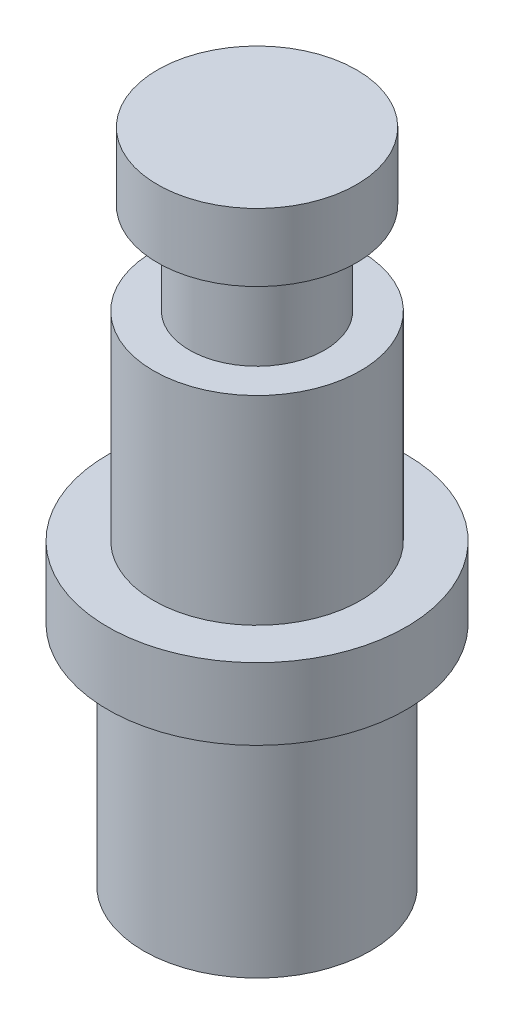
ISO-10303-21;
HEADER;
FILE_DESCRIPTION(('STEP AP214'),'2;1');
FILE_NAME('part.step','',(''),(''),'','','');
FILE_SCHEMA(('AUTOMOTIVE_DESIGN { 1 0 10303 214 1 1 1 1 }'));
ENDSEC;
DATA;
#1=APPLICATION_CONTEXT('core data for automotive mechanical design processes');
#2=APPLICATION_PROTOCOL_DEFINITION('international standard','automotive_design',2000,#1);
#3=PRODUCT_CONTEXT('',#1,'mechanical');
#4=PRODUCT('Part','Part','',(#3));
#5=PRODUCT_RELATED_PRODUCT_CATEGORY('part','',(#4));
#6=PRODUCT_DEFINITION_FORMATION('','',#4);
#7=PRODUCT_DEFINITION_CONTEXT('part definition',#1,'design');
#8=PRODUCT_DEFINITION('design','',#6,#7);
#9=PRODUCT_DEFINITION_SHAPE('','',#8);
#10=(LENGTH_UNIT() NAMED_UNIT(*) SI_UNIT(.MILLI.,.METRE.));
#11=(NAMED_UNIT(*) PLANE_ANGLE_UNIT() SI_UNIT($,.RADIAN.));
#12=(NAMED_UNIT(*) SI_UNIT($,.STERADIAN.) SOLID_ANGLE_UNIT());
#13=UNCERTAINTY_MEASURE_WITH_UNIT(LENGTH_MEASURE(1.E-05),#10,'distance_accuracy_value','');
#14=(GEOMETRIC_REPRESENTATION_CONTEXT(3) GLOBAL_UNCERTAINTY_ASSIGNED_CONTEXT((#13)) GLOBAL_UNIT_ASSIGNED_CONTEXT((#10,
#11,#12)) REPRESENTATION_CONTEXT('',''));
#15=CARTESIAN_POINT('',(0.,0.,0.));
#16=DIRECTION('',(0.,0.,1.));
#17=DIRECTION('',(1.,0.,0.));
#18=AXIS2_PLACEMENT_3D('',#15,#16,#17);
#19=CARTESIAN_POINT('',(0.,0.,0.));
#20=DIRECTION('',(0.,-1.,0.));
#21=DIRECTION('',(0.,0.,-1.));
#22=AXIS2_PLACEMENT_3D('',#19,#20,#21);
#23=PLANE('',#22);
#24=CARTESIAN_POINT('',(0.,0.,0.));
#25=DIRECTION('',(0.,-1.,0.));
#26=DIRECTION('',(0.,0.,-1.));
#27=AXIS2_PLACEMENT_3D('',#24,#25,#26);
#28=CIRCLE('',#27,3.6195);
#29=CARTESIAN_POINT('',(0.,0.,-3.6195));
#30=VERTEX_POINT('',#29);
#31=EDGE_CURVE('E12',#30,#30,#28,.T.);
#32=ORIENTED_EDGE('',*,*,#31,.T.);
#33=EDGE_LOOP('',(#32));
#34=FACE_BOUND('',#33,.T.);
#35=ADVANCED_FACE('F50',(#34),#23,.T.);
#36=CARTESIAN_POINT('',(0.,0.,0.));
#37=DIRECTION('',(0.,-1.,0.));
#38=DIRECTION('',(0.,0.,-1.));
#39=AXIS2_PLACEMENT_3D('',#36,#37,#38);
#40=CYLINDRICAL_SURFACE('',#39,3.6195);
#41=CARTESIAN_POINT('',(0.,7.239,0.));
#42=DIRECTION('',(0.,-1.,0.));
#43=DIRECTION('',(0.,0.,-1.));
#44=AXIS2_PLACEMENT_3D('',#41,#42,#43);
#45=CIRCLE('',#44,3.6195);
#46=CARTESIAN_POINT('',(0.,7.239,-3.6195));
#47=VERTEX_POINT('',#46);
#48=EDGE_CURVE('E57',#47,#47,#45,.T.);
#49=ORIENTED_EDGE('',*,*,#48,.T.);
#50=EDGE_LOOP('',(#49));
#51=FACE_BOUND('',#50,.T.);
#52=ORIENTED_EDGE('',*,*,#31,.F.);
#53=EDGE_LOOP('',(#52));
#54=FACE_BOUND('',#53,.T.);
#55=ADVANCED_FACE('F110',(#51,#54),#40,.T.);
#56=CARTESIAN_POINT('',(3.6195,7.239,0.));
#57=DIRECTION('',(0.,-1.,0.));
#58=DIRECTION('',(0.,0.,-1.));
#59=AXIS2_PLACEMENT_3D('',#56,#57,#58);
#60=PLANE('',#59);
#61=CARTESIAN_POINT('',(0.,7.239,0.));
#62=DIRECTION('',(0.,-1.,0.));
#63=DIRECTION('',(0.,0.,-1.));
#64=AXIS2_PLACEMENT_3D('',#61,#62,#63);
#65=CIRCLE('',#64,4.7625);
#66=CARTESIAN_POINT('',(0.,7.239,-4.7625));
#67=VERTEX_POINT('',#66);
#68=EDGE_CURVE('E63',#67,#67,#65,.T.);
#69=ORIENTED_EDGE('',*,*,#68,.T.);
#70=EDGE_LOOP('',(#69));
#71=FACE_BOUND('',#70,.T.);
#72=ORIENTED_EDGE('',*,*,#48,.F.);
#73=EDGE_LOOP('',(#72));
#74=FACE_BOUND('',#73,.T.);
#75=ADVANCED_FACE('F114',(#71,#74),#60,.T.);
#76=CARTESIAN_POINT('',(0.,0.,0.));
#77=DIRECTION('',(0.,-1.,0.));
#78=DIRECTION('',(0.,0.,-1.));
#79=AXIS2_PLACEMENT_3D('',#76,#77,#78);
#80=CYLINDRICAL_SURFACE('',#79,4.7625);
#81=CARTESIAN_POINT('',(0.,9.525,0.));
#82=DIRECTION('',(0.,-1.,0.));
#83=DIRECTION('',(0.,0.,-1.));
#84=AXIS2_PLACEMENT_3D('',#81,#82,#83);
#85=CIRCLE('',#84,4.7625);
#86=CARTESIAN_POINT('',(0.,9.525,-4.7625));
#87=VERTEX_POINT('',#86);
#88=EDGE_CURVE('E68',#87,#87,#85,.T.);
#89=ORIENTED_EDGE('',*,*,#88,.T.);
#90=EDGE_LOOP('',(#89));
#91=FACE_BOUND('',#90,.T.);
#92=ORIENTED_EDGE('',*,*,#68,.F.);
#93=EDGE_LOOP('',(#92));
#94=FACE_BOUND('',#93,.T.);
#95=ADVANCED_FACE('F118',(#91,#94),#80,.T.);
#96=CARTESIAN_POINT('',(4.7625,9.525,0.));
#97=DIRECTION('',(0.,1.,0.));
#98=DIRECTION('',(0.,0.,1.));
#99=AXIS2_PLACEMENT_3D('',#96,#97,#98);
#100=PLANE('',#99);
#101=CARTESIAN_POINT('',(0.,9.525,0.));
#102=DIRECTION('',(0.,-1.,0.));
#103=DIRECTION('',(0.,0.,-1.));
#104=AXIS2_PLACEMENT_3D('',#101,#102,#103);
#105=CIRCLE('',#104,3.302);
#106=CARTESIAN_POINT('',(0.,9.525,-3.302));
#107=VERTEX_POINT('',#106);
#108=EDGE_CURVE('E73',#107,#107,#105,.T.);
#109=ORIENTED_EDGE('',*,*,#108,.T.);
#110=EDGE_LOOP('',(#109));
#111=FACE_BOUND('',#110,.T.);
#112=ORIENTED_EDGE('',*,*,#88,.F.);
#113=EDGE_LOOP('',(#112));
#114=FACE_BOUND('',#113,.T.);
#115=ADVANCED_FACE('F125',(#111,#114),#100,.T.);
#116=CARTESIAN_POINT('',(0.,0.,0.));
#117=DIRECTION('',(0.,-1.,0.));
#118=DIRECTION('',(0.,0.,-1.));
#119=AXIS2_PLACEMENT_3D('',#116,#117,#118);
#120=CYLINDRICAL_SURFACE('',#119,3.302);
#121=CARTESIAN_POINT('',(0.,15.875,0.));
#122=DIRECTION('',(0.,-1.,0.));
#123=DIRECTION('',(0.,0.,-1.));
#124=AXIS2_PLACEMENT_3D('',#121,#122,#123);
#125=CIRCLE('',#124,3.302);
#126=CARTESIAN_POINT('',(0.,15.875,-3.302));
#127=VERTEX_POINT('',#126);
#128=EDGE_CURVE('E77',#127,#127,#125,.T.);
#129=ORIENTED_EDGE('',*,*,#128,.T.);
#130=EDGE_LOOP('',(#129));
#131=FACE_BOUND('',#130,.T.);
#132=ORIENTED_EDGE('',*,*,#108,.F.);
#133=EDGE_LOOP('',(#132));
#134=FACE_BOUND('',#133,.T.);
#135=ADVANCED_FACE('F129',(#131,#134),#120,.T.);
#136=CARTESIAN_POINT('',(3.302,15.875,0.));
#137=DIRECTION('',(0.,1.,0.));
#138=DIRECTION('',(0.,0.,1.));
#139=AXIS2_PLACEMENT_3D('',#136,#137,#138);
#140=PLANE('',#139);
#141=CARTESIAN_POINT('',(0.,15.875,0.));
#142=DIRECTION('',(0.,-1.,0.));
#143=DIRECTION('',(0.,0.,-1.));
#144=AXIS2_PLACEMENT_3D('',#141,#142,#143);
#145=CIRCLE('',#144,2.159);
#146=CARTESIAN_POINT('',(0.,15.875,-2.159));
#147=VERTEX_POINT('',#146);
#148=EDGE_CURVE('E81',#147,#147,#145,.T.);
#149=ORIENTED_EDGE('',*,*,#148,.T.);
#150=EDGE_LOOP('',(#149));
#151=FACE_BOUND('',#150,.T.);
#152=ORIENTED_EDGE('',*,*,#128,.F.);
#153=EDGE_LOOP('',(#152));
#154=FACE_BOUND('',#153,.T.);
#155=ADVANCED_FACE('F133',(#151,#154),#140,.T.);
#156=CARTESIAN_POINT('',(0.,0.,0.));
#157=DIRECTION('',(0.,-1.,0.));
#158=DIRECTION('',(0.,0.,-1.));
#159=AXIS2_PLACEMENT_3D('',#156,#157,#158);
#160=CYLINDRICAL_SURFACE('',#159,2.159);
#161=CARTESIAN_POINT('',(0.,18.796,0.));
#162=DIRECTION('',(0.,-1.,0.));
#163=DIRECTION('',(0.,0.,-1.));
#164=AXIS2_PLACEMENT_3D('',#161,#162,#163);
#165=CIRCLE('',#164,2.159);
#166=CARTESIAN_POINT('',(0.,18.796,-2.159));
#167=VERTEX_POINT('',#166);
#168=EDGE_CURVE('E85',#167,#167,#165,.T.);
#169=ORIENTED_EDGE('',*,*,#168,.T.);
#170=EDGE_LOOP('',(#169));
#171=FACE_BOUND('',#170,.T.);
#172=ORIENTED_EDGE('',*,*,#148,.F.);
#173=EDGE_LOOP('',(#172));
#174=FACE_BOUND('',#173,.T.);
#175=ADVANCED_FACE('F137',(#171,#174),#160,.T.);
#176=CARTESIAN_POINT('',(2.159,18.796,0.));
#177=DIRECTION('',(0.,-1.,0.));
#178=DIRECTION('',(0.,0.,-1.));
#179=AXIS2_PLACEMENT_3D('',#176,#177,#178);
#180=PLANE('',#179);
#181=CARTESIAN_POINT('',(0.,18.796,0.));
#182=DIRECTION('',(0.,-1.,0.));
#183=DIRECTION('',(0.,0.,-1.));
#184=AXIS2_PLACEMENT_3D('',#181,#182,#183);
#185=CIRCLE('',#184,3.175);
#186=CARTESIAN_POINT('',(0.,18.796,-3.175));
#187=VERTEX_POINT('',#186);
#188=EDGE_CURVE('E89',#187,#187,#185,.T.);
#189=ORIENTED_EDGE('',*,*,#188,.T.);
#190=EDGE_LOOP('',(#189));
#191=FACE_BOUND('',#190,.T.);
#192=ORIENTED_EDGE('',*,*,#168,.F.);
#193=EDGE_LOOP('',(#192));
#194=FACE_BOUND('',#193,.T.);
#195=ADVANCED_FACE('F107',(#191,#194),#180,.T.);
#196=CARTESIAN_POINT('',(0.,0.,0.));
#197=DIRECTION('',(0.,-1.,0.));
#198=DIRECTION('',(0.,0.,-1.));
#199=AXIS2_PLACEMENT_3D('',#196,#197,#198);
#200=CYLINDRICAL_SURFACE('',#199,3.175);
#201=CARTESIAN_POINT('',(0.,20.955,0.));
#202=DIRECTION('',(0.,-1.,0.));
#203=DIRECTION('',(0.,0.,-1.));
#204=AXIS2_PLACEMENT_3D('',#201,#202,#203);
#205=CIRCLE('',#204,3.175);
#206=CARTESIAN_POINT('',(0.,20.955,-3.175));
#207=VERTEX_POINT('',#206);
#208=EDGE_CURVE('E93',#207,#207,#205,.T.);
#209=ORIENTED_EDGE('',*,*,#208,.T.);
#210=EDGE_LOOP('',(#209));
#211=FACE_BOUND('',#210,.T.);
#212=ORIENTED_EDGE('',*,*,#188,.F.);
#213=EDGE_LOOP('',(#212));
#214=FACE_BOUND('',#213,.T.);
#215=ADVANCED_FACE('F98',(#211,#214),#200,.T.);
#216=CARTESIAN_POINT('',(3.175,20.955,0.));
#217=DIRECTION('',(0.,1.,0.));
#218=DIRECTION('',(0.,0.,1.));
#219=AXIS2_PLACEMENT_3D('',#216,#217,#218);
#220=PLANE('',#219);
#221=ORIENTED_EDGE('',*,*,#208,.F.);
#222=EDGE_LOOP('',(#221));
#223=FACE_BOUND('',#222,.T.);
#224=ADVANCED_FACE('F101',(#223),#220,.T.);
#225=CLOSED_SHELL('',(#35,#55,#75,#95,#115,#135,#155,#175,#195,#215,#224));
#226=MANIFOLD_SOLID_BREP('B2',#225);
#227=ADVANCED_BREP_SHAPE_REPRESENTATION('',(#18,#226),#14);
#228=SHAPE_DEFINITION_REPRESENTATION(#9,#227);
ENDSEC;
END-ISO-10303-21;
